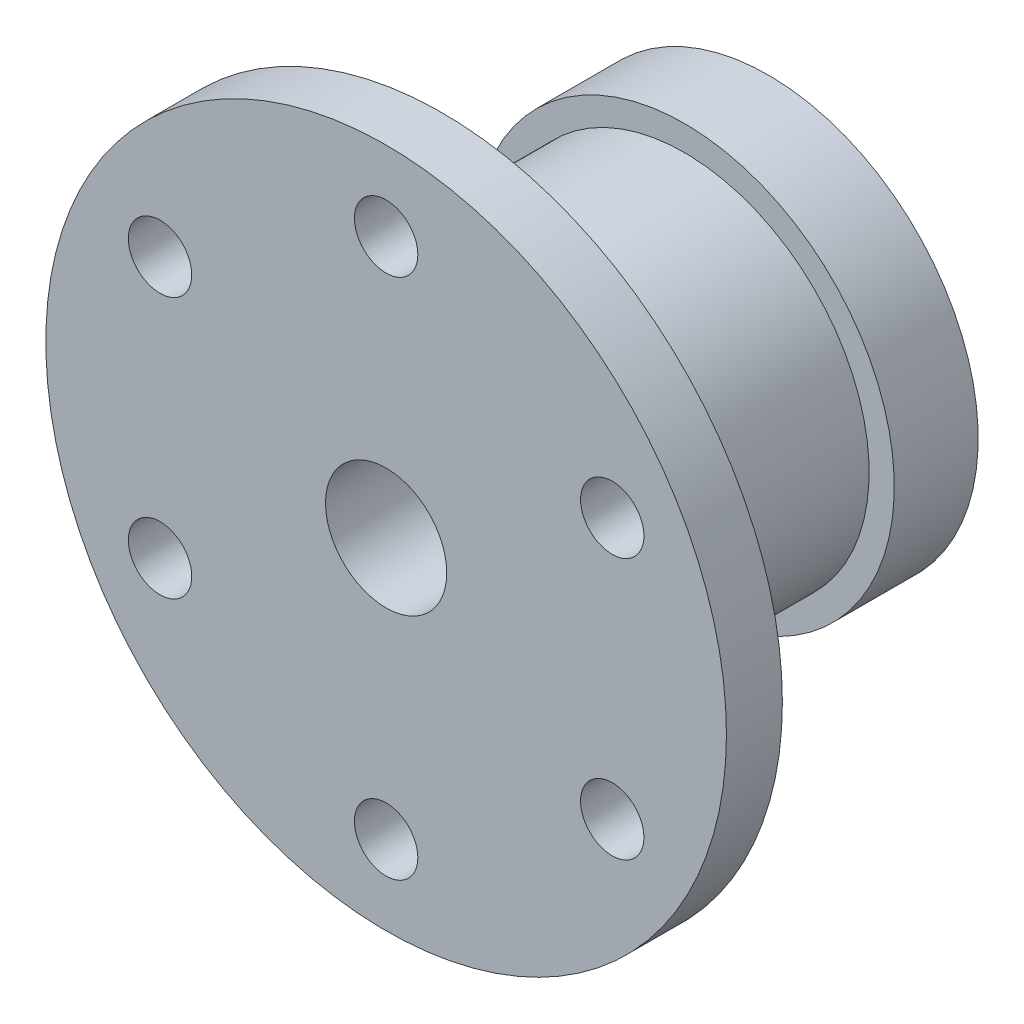
ISO-10303-21;
HEADER;
FILE_DESCRIPTION(('STEP AP214'),'2;1');
FILE_NAME('part.step','',(''),(''),'','','');
FILE_SCHEMA(('AUTOMOTIVE_DESIGN { 1 0 10303 214 1 1 1 1 }'));
ENDSEC;
DATA;
#1=APPLICATION_CONTEXT('core data for automotive mechanical design processes');
#2=APPLICATION_PROTOCOL_DEFINITION('international standard','automotive_design',2000,#1);
#3=PRODUCT_CONTEXT('',#1,'mechanical');
#4=PRODUCT('Part','Part','',(#3));
#5=PRODUCT_RELATED_PRODUCT_CATEGORY('part','',(#4));
#6=PRODUCT_DEFINITION_FORMATION('','',#4);
#7=PRODUCT_DEFINITION_CONTEXT('part definition',#1,'design');
#8=PRODUCT_DEFINITION('design','',#6,#7);
#9=PRODUCT_DEFINITION_SHAPE('','',#8);
#10=(LENGTH_UNIT() NAMED_UNIT(*) SI_UNIT(.MILLI.,.METRE.));
#11=(NAMED_UNIT(*) PLANE_ANGLE_UNIT() SI_UNIT($,.RADIAN.));
#12=(NAMED_UNIT(*) SI_UNIT($,.STERADIAN.) SOLID_ANGLE_UNIT());
#13=UNCERTAINTY_MEASURE_WITH_UNIT(LENGTH_MEASURE(1.E-05),#10,'distance_accuracy_value','');
#14=(GEOMETRIC_REPRESENTATION_CONTEXT(3) GLOBAL_UNCERTAINTY_ASSIGNED_CONTEXT((#13)) GLOBAL_UNIT_ASSIGNED_CONTEXT((#10,
#11,#12)) REPRESENTATION_CONTEXT('',''));
#15=CARTESIAN_POINT('',(0.,0.,0.));
#16=DIRECTION('',(0.,0.,1.));
#17=DIRECTION('',(1.,0.,0.));
#18=AXIS2_PLACEMENT_3D('',#15,#16,#17);
#19=CARTESIAN_POINT('',(0.,0.,3.));
#20=DIRECTION('',(0.,0.,-1.));
#21=DIRECTION('',(-1.,0.,0.));
#22=AXIS2_PLACEMENT_3D('',#19,#20,#21);
#23=CYLINDRICAL_SURFACE('',#22,3.25);
#24=CARTESIAN_POINT('',(0.,0.,3.));
#25=DIRECTION('',(0.,0.,1.));
#26=DIRECTION('',(1.,0.,0.));
#27=AXIS2_PLACEMENT_3D('',#24,#25,#26);
#28=CIRCLE('',#27,3.25);
#29=CARTESIAN_POINT('',(3.25,0.,3.));
#30=VERTEX_POINT('',#29);
#31=EDGE_CURVE('E60',#30,#30,#28,.T.);
#32=ORIENTED_EDGE('',*,*,#31,.T.);
#33=EDGE_LOOP('',(#32));
#34=FACE_BOUND('',#33,.T.);
#35=CARTESIAN_POINT('',(0.,0.,-16.9));
#36=DIRECTION('',(0.,0.,-1.));
#37=DIRECTION('',(-1.,0.,0.));
#38=AXIS2_PLACEMENT_3D('',#35,#36,#37);
#39=CIRCLE('',#38,3.25);
#40=CARTESIAN_POINT('',(-3.25,0.,-16.9));
#41=VERTEX_POINT('',#40);
#42=EDGE_CURVE('E43',#41,#41,#39,.T.);
#43=ORIENTED_EDGE('',*,*,#42,.T.);
#44=EDGE_LOOP('',(#43));
#45=FACE_BOUND('',#44,.T.);
#46=ADVANCED_FACE('F39',(#34,#45),#23,.F.);
#47=CARTESIAN_POINT('',(0.,0.,-17.5));
#48=DIRECTION('',(0.,0.,1.));
#49=DIRECTION('',(1.,0.,0.));
#50=AXIS2_PLACEMENT_3D('',#47,#48,#49);
#51=CYLINDRICAL_SURFACE('',#50,9.9);
#52=CARTESIAN_POINT('',(0.,0.,0.));
#53=DIRECTION('',(0.,0.,-1.));
#54=DIRECTION('',(-1.,0.,0.));
#55=AXIS2_PLACEMENT_3D('',#52,#53,#54);
#56=CIRCLE('',#55,9.9);
#57=CARTESIAN_POINT('',(-9.9,0.,0.));
#58=VERTEX_POINT('',#57);
#59=EDGE_CURVE('E50',#58,#58,#56,.T.);
#60=ORIENTED_EDGE('',*,*,#59,.T.);
#61=EDGE_LOOP('',(#60));
#62=FACE_BOUND('',#61,.T.);
#63=CARTESIAN_POINT('',(0.,0.,-13.));
#64=DIRECTION('',(0.,0.,-1.));
#65=DIRECTION('',(-1.,0.,0.));
#66=AXIS2_PLACEMENT_3D('',#63,#64,#65);
#67=CIRCLE('',#66,9.9);
#68=CARTESIAN_POINT('',(-9.9,0.,-13.));
#69=VERTEX_POINT('',#68);
#70=EDGE_CURVE('E10',#69,#69,#67,.T.);
#71=ORIENTED_EDGE('',*,*,#70,.F.);
#72=EDGE_LOOP('',(#71));
#73=FACE_BOUND('',#72,.T.);
#74=ADVANCED_FACE('F183',(#62,#73),#51,.T.);
#75=CARTESIAN_POINT('',(0.,0.,3.));
#76=DIRECTION('',(0.,0.,1.));
#77=DIRECTION('',(1.,0.,0.));
#78=AXIS2_PLACEMENT_3D('',#75,#76,#77);
#79=PLANE('',#78);
#80=CARTESIAN_POINT('',(12.1243556529821,-7.,3.));
#81=DIRECTION('',(0.,0.,1.));
#82=DIRECTION('',(1.,0.,0.));
#83=AXIS2_PLACEMENT_3D('',#80,#81,#82);
#84=CIRCLE('',#83,1.7);
#85=CARTESIAN_POINT('',(13.8243556529821,-7.,3.));
#86=VERTEX_POINT('',#85);
#87=EDGE_CURVE('E80',#86,#86,#84,.T.);
#88=ORIENTED_EDGE('',*,*,#87,.F.);
#89=EDGE_LOOP('',(#88));
#90=FACE_BOUND('',#89,.T.);
#91=CARTESIAN_POINT('',(0.,-14.,3.));
#92=DIRECTION('',(0.,0.,1.));
#93=DIRECTION('',(1.,0.,0.));
#94=AXIS2_PLACEMENT_3D('',#91,#92,#93);
#95=CIRCLE('',#94,1.7);
#96=CARTESIAN_POINT('',(1.7,-14.,3.));
#97=VERTEX_POINT('',#96);
#98=EDGE_CURVE('E83',#97,#97,#95,.T.);
#99=ORIENTED_EDGE('',*,*,#98,.F.);
#100=EDGE_LOOP('',(#99));
#101=FACE_BOUND('',#100,.T.);
#102=CARTESIAN_POINT('',(-12.1243556529821,-7.,3.));
#103=DIRECTION('',(0.,0.,1.));
#104=DIRECTION('',(1.,0.,0.));
#105=AXIS2_PLACEMENT_3D('',#102,#103,#104);
#106=CIRCLE('',#105,1.7);
#107=CARTESIAN_POINT('',(-10.4243556529821,-7.,3.));
#108=VERTEX_POINT('',#107);
#109=EDGE_CURVE('E89',#108,#108,#106,.T.);
#110=ORIENTED_EDGE('',*,*,#109,.F.);
#111=EDGE_LOOP('',(#110));
#112=FACE_BOUND('',#111,.T.);
#113=CARTESIAN_POINT('',(-12.1243556529821,7.,3.));
#114=DIRECTION('',(0.,0.,1.));
#115=DIRECTION('',(1.,0.,0.));
#116=AXIS2_PLACEMENT_3D('',#113,#114,#115);
#117=CIRCLE('',#116,1.7);
#118=CARTESIAN_POINT('',(-10.4243556529821,7.,3.));
#119=VERTEX_POINT('',#118);
#120=EDGE_CURVE('E96',#119,#119,#117,.T.);
#121=ORIENTED_EDGE('',*,*,#120,.F.);
#122=EDGE_LOOP('',(#121));
#123=FACE_BOUND('',#122,.T.);
#124=CARTESIAN_POINT('',(0.,14.,3.));
#125=DIRECTION('',(0.,0.,1.));
#126=DIRECTION('',(1.,0.,0.));
#127=AXIS2_PLACEMENT_3D('',#124,#125,#126);
#128=CIRCLE('',#127,1.7);
#129=CARTESIAN_POINT('',(1.7,14.,3.));
#130=VERTEX_POINT('',#129);
#131=EDGE_CURVE('E75',#130,#130,#128,.T.);
#132=ORIENTED_EDGE('',*,*,#131,.F.);
#133=EDGE_LOOP('',(#132));
#134=FACE_BOUND('',#133,.T.);
#135=CARTESIAN_POINT('',(12.1243556529821,7.,3.));
#136=DIRECTION('',(0.,0.,1.));
#137=DIRECTION('',(1.,0.,0.));
#138=AXIS2_PLACEMENT_3D('',#135,#136,#137);
#139=CIRCLE('',#138,1.7);
#140=CARTESIAN_POINT('',(13.8243556529821,7.,3.));
#141=VERTEX_POINT('',#140);
#142=EDGE_CURVE('E68',#141,#141,#139,.T.);
#143=ORIENTED_EDGE('',*,*,#142,.F.);
#144=EDGE_LOOP('',(#143));
#145=FACE_BOUND('',#144,.T.);
#146=CARTESIAN_POINT('',(0.,0.,3.));
#147=DIRECTION('',(0.,0.,1.));
#148=DIRECTION('',(1.,0.,0.));
#149=AXIS2_PLACEMENT_3D('',#146,#147,#148);
#150=CIRCLE('',#149,18.25);
#151=CARTESIAN_POINT('',(18.25,0.,3.));
#152=VERTEX_POINT('',#151);
#153=EDGE_CURVE('E51',#152,#152,#150,.T.);
#154=ORIENTED_EDGE('',*,*,#153,.T.);
#155=EDGE_LOOP('',(#154));
#156=FACE_BOUND('',#155,.T.);
#157=ORIENTED_EDGE('',*,*,#31,.F.);
#158=EDGE_LOOP('',(#157));
#159=FACE_BOUND('',#158,.T.);
#160=ADVANCED_FACE('F191',(#90,#101,#112,#123,#134,#145,#156,#159),#79,.T.);
#161=CARTESIAN_POINT('',(0.,0.,0.));
#162=DIRECTION('',(0.,0.,1.));
#163=DIRECTION('',(1.,0.,0.));
#164=AXIS2_PLACEMENT_3D('',#161,#162,#163);
#165=PLANE('',#164);
#166=CARTESIAN_POINT('',(12.1243556529821,-7.,0.));
#167=DIRECTION('',(0.,0.,1.));
#168=DIRECTION('',(1.,0.,0.));
#169=AXIS2_PLACEMENT_3D('',#166,#167,#168);
#170=CIRCLE('',#169,1.7);
#171=CARTESIAN_POINT('',(13.8243556529821,-7.,0.));
#172=VERTEX_POINT('',#171);
#173=EDGE_CURVE('E73',#172,#172,#170,.T.);
#174=ORIENTED_EDGE('',*,*,#173,.T.);
#175=EDGE_LOOP('',(#174));
#176=FACE_BOUND('',#175,.T.);
#177=CARTESIAN_POINT('',(0.,-14.,0.));
#178=DIRECTION('',(0.,0.,1.));
#179=DIRECTION('',(1.,0.,0.));
#180=AXIS2_PLACEMENT_3D('',#177,#178,#179);
#181=CIRCLE('',#180,1.7);
#182=CARTESIAN_POINT('',(1.7,-14.,0.));
#183=VERTEX_POINT('',#182);
#184=EDGE_CURVE('E81',#183,#183,#181,.T.);
#185=ORIENTED_EDGE('',*,*,#184,.T.);
#186=EDGE_LOOP('',(#185));
#187=FACE_BOUND('',#186,.T.);
#188=CARTESIAN_POINT('',(-12.1243556529821,-7.,0.));
#189=DIRECTION('',(0.,0.,1.));
#190=DIRECTION('',(1.,0.,0.));
#191=AXIS2_PLACEMENT_3D('',#188,#189,#190);
#192=CIRCLE('',#191,1.7);
#193=CARTESIAN_POINT('',(-10.4243556529821,-7.,0.));
#194=VERTEX_POINT('',#193);
#195=EDGE_CURVE('E87',#194,#194,#192,.T.);
#196=ORIENTED_EDGE('',*,*,#195,.T.);
#197=EDGE_LOOP('',(#196));
#198=FACE_BOUND('',#197,.T.);
#199=CARTESIAN_POINT('',(-12.1243556529821,7.,0.));
#200=DIRECTION('',(0.,0.,1.));
#201=DIRECTION('',(1.,0.,0.));
#202=AXIS2_PLACEMENT_3D('',#199,#200,#201);
#203=CIRCLE('',#202,1.7);
#204=CARTESIAN_POINT('',(-10.4243556529821,7.,0.));
#205=VERTEX_POINT('',#204);
#206=EDGE_CURVE('E91',#205,#205,#203,.T.);
#207=ORIENTED_EDGE('',*,*,#206,.T.);
#208=EDGE_LOOP('',(#207));
#209=FACE_BOUND('',#208,.T.);
#210=CARTESIAN_POINT('',(0.,14.,0.));
#211=DIRECTION('',(0.,0.,1.));
#212=DIRECTION('',(1.,0.,0.));
#213=AXIS2_PLACEMENT_3D('',#210,#211,#212);
#214=CIRCLE('',#213,1.7);
#215=CARTESIAN_POINT('',(1.7,14.,0.));
#216=VERTEX_POINT('',#215);
#217=EDGE_CURVE('E97',#216,#216,#214,.T.);
#218=ORIENTED_EDGE('',*,*,#217,.T.);
#219=EDGE_LOOP('',(#218));
#220=FACE_BOUND('',#219,.T.);
#221=CARTESIAN_POINT('',(12.1243556529821,7.,0.));
#222=DIRECTION('',(0.,0.,1.));
#223=DIRECTION('',(1.,0.,0.));
#224=AXIS2_PLACEMENT_3D('',#221,#222,#223);
#225=CIRCLE('',#224,1.7);
#226=CARTESIAN_POINT('',(13.8243556529821,7.,0.));
#227=VERTEX_POINT('',#226);
#228=EDGE_CURVE('E66',#227,#227,#225,.T.);
#229=ORIENTED_EDGE('',*,*,#228,.T.);
#230=EDGE_LOOP('',(#229));
#231=FACE_BOUND('',#230,.T.);
#232=ORIENTED_EDGE('',*,*,#59,.F.);
#233=EDGE_LOOP('',(#232));
#234=FACE_BOUND('',#233,.T.);
#235=CARTESIAN_POINT('',(0.,0.,0.));
#236=DIRECTION('',(0.,0.,1.));
#237=DIRECTION('',(1.,0.,0.));
#238=AXIS2_PLACEMENT_3D('',#235,#236,#237);
#239=CIRCLE('',#238,18.25);
#240=CARTESIAN_POINT('',(18.25,0.,0.));
#241=VERTEX_POINT('',#240);
#242=EDGE_CURVE('E53',#241,#241,#239,.T.);
#243=ORIENTED_EDGE('',*,*,#242,.F.);
#244=EDGE_LOOP('',(#243));
#245=FACE_BOUND('',#244,.T.);
#246=ADVANCED_FACE('F197',(#176,#187,#198,#209,#220,#231,#234,#245),#165,.F.);
#247=CARTESIAN_POINT('',(0.,0.,3.));
#248=DIRECTION('',(0.,0.,-1.));
#249=DIRECTION('',(-1.,0.,0.));
#250=AXIS2_PLACEMENT_3D('',#247,#248,#249);
#251=CYLINDRICAL_SURFACE('',#250,18.25);
#252=ORIENTED_EDGE('',*,*,#153,.F.);
#253=EDGE_LOOP('',(#252));
#254=FACE_BOUND('',#253,.T.);
#255=ORIENTED_EDGE('',*,*,#242,.T.);
#256=EDGE_LOOP('',(#255));
#257=FACE_BOUND('',#256,.T.);
#258=ADVANCED_FACE('F41',(#254,#257),#251,.T.);
#259=CARTESIAN_POINT('',(0.,0.,-17.5));
#260=DIRECTION('',(0.,0.,-1.));
#261=DIRECTION('',(-1.,0.,0.));
#262=AXIS2_PLACEMENT_3D('',#259,#260,#261);
#263=PLANE('',#262);
#264=CARTESIAN_POINT('',(0.,0.,-17.5));
#265=DIRECTION('',(0.,0.,-1.));
#266=DIRECTION('',(-1.,0.,0.));
#267=AXIS2_PLACEMENT_3D('',#264,#265,#266);
#268=CIRCLE('',#267,10.175);
#269=CARTESIAN_POINT('',(-10.175,0.,-17.5));
#270=VERTEX_POINT('',#269);
#271=EDGE_CURVE('E102',#270,#270,#268,.T.);
#272=ORIENTED_EDGE('',*,*,#271,.F.);
#273=EDGE_LOOP('',(#272));
#274=FACE_BOUND('',#273,.T.);
#275=CARTESIAN_POINT('',(0.,0.,-17.5));
#276=DIRECTION('',(0.,0.,-1.));
#277=DIRECTION('',(-1.,0.,0.));
#278=AXIS2_PLACEMENT_3D('',#275,#276,#277);
#279=CIRCLE('',#278,11.25);
#280=CARTESIAN_POINT('',(-11.25,0.,-17.5));
#281=VERTEX_POINT('',#280);
#282=EDGE_CURVE('E65',#281,#281,#279,.T.);
#283=ORIENTED_EDGE('',*,*,#282,.T.);
#284=EDGE_LOOP('',(#283));
#285=FACE_BOUND('',#284,.T.);
#286=ADVANCED_FACE('F170',(#274,#285),#263,.T.);
#287=CARTESIAN_POINT('',(0.,0.,-13.));
#288=DIRECTION('',(0.,0.,-1.));
#289=DIRECTION('',(-1.,0.,0.));
#290=AXIS2_PLACEMENT_3D('',#287,#288,#289);
#291=CYLINDRICAL_SURFACE('',#290,11.25);
#292=CARTESIAN_POINT('',(0.,0.,-13.));
#293=DIRECTION('',(0.,0.,-1.));
#294=DIRECTION('',(-1.,0.,0.));
#295=AXIS2_PLACEMENT_3D('',#292,#293,#294);
#296=CIRCLE('',#295,11.25);
#297=CARTESIAN_POINT('',(-11.25,0.,-13.));
#298=VERTEX_POINT('',#297);
#299=EDGE_CURVE('E62',#298,#298,#296,.T.);
#300=ORIENTED_EDGE('',*,*,#299,.T.);
#301=EDGE_LOOP('',(#300));
#302=FACE_BOUND('',#301,.T.);
#303=ORIENTED_EDGE('',*,*,#282,.F.);
#304=EDGE_LOOP('',(#303));
#305=FACE_BOUND('',#304,.T.);
#306=ADVANCED_FACE('F168',(#302,#305),#291,.T.);
#307=CARTESIAN_POINT('',(0.,0.,-13.));
#308=DIRECTION('',(0.,0.,-1.));
#309=DIRECTION('',(-1.,0.,0.));
#310=AXIS2_PLACEMENT_3D('',#307,#308,#309);
#311=PLANE('',#310);
#312=ORIENTED_EDGE('',*,*,#70,.T.);
#313=EDGE_LOOP('',(#312));
#314=FACE_BOUND('',#313,.T.);
#315=ORIENTED_EDGE('',*,*,#299,.F.);
#316=EDGE_LOOP('',(#315));
#317=FACE_BOUND('',#316,.T.);
#318=ADVANCED_FACE('F173',(#314,#317),#311,.F.);
#319=CARTESIAN_POINT('',(12.1243556529821,7.,0.));
#320=DIRECTION('',(0.,0.,1.));
#321=DIRECTION('',(1.,0.,0.));
#322=AXIS2_PLACEMENT_3D('',#319,#320,#321);
#323=CYLINDRICAL_SURFACE('',#322,1.7);
#324=ORIENTED_EDGE('',*,*,#228,.F.);
#325=EDGE_LOOP('',(#324));
#326=FACE_BOUND('',#325,.T.);
#327=ORIENTED_EDGE('',*,*,#142,.T.);
#328=EDGE_LOOP('',(#327));
#329=FACE_BOUND('',#328,.T.);
#330=ADVANCED_FACE('F185',(#326,#329),#323,.F.);
#331=CARTESIAN_POINT('',(0.,14.,0.));
#332=DIRECTION('',(0.,0.,1.));
#333=DIRECTION('',(1.,0.,0.));
#334=AXIS2_PLACEMENT_3D('',#331,#332,#333);
#335=CYLINDRICAL_SURFACE('',#334,1.7);
#336=ORIENTED_EDGE('',*,*,#217,.F.);
#337=EDGE_LOOP('',(#336));
#338=FACE_BOUND('',#337,.T.);
#339=ORIENTED_EDGE('',*,*,#131,.T.);
#340=EDGE_LOOP('',(#339));
#341=FACE_BOUND('',#340,.T.);
#342=ADVANCED_FACE('F223',(#338,#341),#335,.F.);
#343=CARTESIAN_POINT('',(-12.1243556529821,7.,0.));
#344=DIRECTION('',(0.,0.,1.));
#345=DIRECTION('',(1.,0.,0.));
#346=AXIS2_PLACEMENT_3D('',#343,#344,#345);
#347=CYLINDRICAL_SURFACE('',#346,1.7);
#348=ORIENTED_EDGE('',*,*,#206,.F.);
#349=EDGE_LOOP('',(#348));
#350=FACE_BOUND('',#349,.T.);
#351=ORIENTED_EDGE('',*,*,#120,.T.);
#352=EDGE_LOOP('',(#351));
#353=FACE_BOUND('',#352,.T.);
#354=ADVANCED_FACE('F237',(#350,#353),#347,.F.);
#355=CARTESIAN_POINT('',(-12.1243556529821,-7.,0.));
#356=DIRECTION('',(0.,0.,1.));
#357=DIRECTION('',(1.,0.,0.));
#358=AXIS2_PLACEMENT_3D('',#355,#356,#357);
#359=CYLINDRICAL_SURFACE('',#358,1.7);
#360=ORIENTED_EDGE('',*,*,#195,.F.);
#361=EDGE_LOOP('',(#360));
#362=FACE_BOUND('',#361,.T.);
#363=ORIENTED_EDGE('',*,*,#109,.T.);
#364=EDGE_LOOP('',(#363));
#365=FACE_BOUND('',#364,.T.);
#366=ADVANCED_FACE('F243',(#362,#365),#359,.F.);
#367=CARTESIAN_POINT('',(0.,-14.,0.));
#368=DIRECTION('',(0.,0.,1.));
#369=DIRECTION('',(1.,0.,0.));
#370=AXIS2_PLACEMENT_3D('',#367,#368,#369);
#371=CYLINDRICAL_SURFACE('',#370,1.7);
#372=ORIENTED_EDGE('',*,*,#184,.F.);
#373=EDGE_LOOP('',(#372));
#374=FACE_BOUND('',#373,.T.);
#375=ORIENTED_EDGE('',*,*,#98,.T.);
#376=EDGE_LOOP('',(#375));
#377=FACE_BOUND('',#376,.T.);
#378=ADVANCED_FACE('F242',(#374,#377),#371,.F.);
#379=CARTESIAN_POINT('',(12.1243556529821,-7.,0.));
#380=DIRECTION('',(0.,0.,1.));
#381=DIRECTION('',(1.,0.,0.));
#382=AXIS2_PLACEMENT_3D('',#379,#380,#381);
#383=CYLINDRICAL_SURFACE('',#382,1.7);
#384=ORIENTED_EDGE('',*,*,#173,.F.);
#385=EDGE_LOOP('',(#384));
#386=FACE_BOUND('',#385,.T.);
#387=ORIENTED_EDGE('',*,*,#87,.T.);
#388=EDGE_LOOP('',(#387));
#389=FACE_BOUND('',#388,.T.);
#390=ADVANCED_FACE('F162',(#386,#389),#383,.F.);
#391=CARTESIAN_POINT('',(0.,0.,-16.9));
#392=DIRECTION('',(0.,0.,-1.));
#393=DIRECTION('',(-1.,0.,0.));
#394=AXIS2_PLACEMENT_3D('',#391,#392,#393);
#395=CYLINDRICAL_SURFACE('',#394,10.175);
#396=CARTESIAN_POINT('',(0.,0.,-16.9));
#397=DIRECTION('',(0.,0.,-1.));
#398=DIRECTION('',(-1.,0.,0.));
#399=AXIS2_PLACEMENT_3D('',#396,#397,#398);
#400=CIRCLE('',#399,10.175);
#401=CARTESIAN_POINT('',(-10.175,0.,-16.9));
#402=VERTEX_POINT('',#401);
#403=EDGE_CURVE('E110',#402,#402,#400,.T.);
#404=ORIENTED_EDGE('',*,*,#403,.F.);
#405=EDGE_LOOP('',(#404));
#406=FACE_BOUND('',#405,.T.);
#407=ORIENTED_EDGE('',*,*,#271,.T.);
#408=EDGE_LOOP('',(#407));
#409=FACE_BOUND('',#408,.T.);
#410=ADVANCED_FACE('F146',(#406,#409),#395,.F.);
#411=CARTESIAN_POINT('',(0.,0.,-16.9));
#412=DIRECTION('',(0.,0.,-1.));
#413=DIRECTION('',(-1.,0.,0.));
#414=AXIS2_PLACEMENT_3D('',#411,#412,#413);
#415=PLANE('',#414);
#416=CARTESIAN_POINT('',(7.071067811865,0.,-16.9));
#417=DIRECTION('',(0.,0.,-1.));
#418=DIRECTION('',(-1.,0.,0.));
#419=AXIS2_PLACEMENT_3D('',#416,#417,#418);
#420=CIRCLE('',#419,0.8);
#421=CARTESIAN_POINT('',(6.271067811865,0.,-16.9));
#422=VERTEX_POINT('',#421);
#423=EDGE_CURVE('E129',#422,#422,#420,.T.);
#424=ORIENTED_EDGE('',*,*,#423,.F.);
#425=EDGE_LOOP('',(#424));
#426=FACE_BOUND('',#425,.T.);
#427=CARTESIAN_POINT('',(0.,7.071067811865,-16.9));
#428=DIRECTION('',(0.,0.,-1.));
#429=DIRECTION('',(-1.,0.,0.));
#430=AXIS2_PLACEMENT_3D('',#427,#428,#429);
#431=CIRCLE('',#430,0.8);
#432=CARTESIAN_POINT('',(-0.8,7.071067811865,-16.9));
#433=VERTEX_POINT('',#432);
#434=EDGE_CURVE('E127',#433,#433,#431,.T.);
#435=ORIENTED_EDGE('',*,*,#434,.F.);
#436=EDGE_LOOP('',(#435));
#437=FACE_BOUND('',#436,.T.);
#438=CARTESIAN_POINT('',(-7.071067811865,0.,-16.9));
#439=DIRECTION('',(0.,0.,-1.));
#440=DIRECTION('',(-1.,0.,0.));
#441=AXIS2_PLACEMENT_3D('',#438,#439,#440);
#442=CIRCLE('',#441,0.799999999999999);
#443=CARTESIAN_POINT('',(-7.871067811865,0.,-16.9));
#444=VERTEX_POINT('',#443);
#445=EDGE_CURVE('E118',#444,#444,#442,.T.);
#446=ORIENTED_EDGE('',*,*,#445,.F.);
#447=EDGE_LOOP('',(#446));
#448=FACE_BOUND('',#447,.T.);
#449=CARTESIAN_POINT('',(0.,-7.071067811865,-16.9));
#450=DIRECTION('',(0.,0.,-1.));
#451=DIRECTION('',(-1.,0.,0.));
#452=AXIS2_PLACEMENT_3D('',#449,#450,#451);
#453=CIRCLE('',#452,0.8);
#454=CARTESIAN_POINT('',(-0.800000000000001,-7.071067811865,-16.9));
#455=VERTEX_POINT('',#454);
#456=EDGE_CURVE('E111',#455,#455,#453,.T.);
#457=ORIENTED_EDGE('',*,*,#456,.F.);
#458=EDGE_LOOP('',(#457));
#459=FACE_BOUND('',#458,.T.);
#460=ORIENTED_EDGE('',*,*,#42,.F.);
#461=EDGE_LOOP('',(#460));
#462=FACE_BOUND('',#461,.T.);
#463=ORIENTED_EDGE('',*,*,#403,.T.);
#464=EDGE_LOOP('',(#463));
#465=FACE_BOUND('',#464,.T.);
#466=ADVANCED_FACE('F145',(#426,#437,#448,#459,#462,#465),#415,.T.);
#467=CARTESIAN_POINT('',(0.,-7.071067811865,-11.9));
#468=DIRECTION('',(0.,0.,-1.));
#469=DIRECTION('',(-1.,0.,0.));
#470=AXIS2_PLACEMENT_3D('',#467,#468,#469);
#471=CYLINDRICAL_SURFACE('',#470,0.8);
#472=CARTESIAN_POINT('',(0.,-7.071067811865,-11.9));
#473=DIRECTION('',(0.,0.,-1.));
#474=DIRECTION('',(-1.,0.,0.));
#475=AXIS2_PLACEMENT_3D('',#472,#473,#474);
#476=CIRCLE('',#475,0.8);
#477=CARTESIAN_POINT('',(-0.800000000000001,-7.071067811865,-11.9));
#478=VERTEX_POINT('',#477);
#479=EDGE_CURVE('E112',#478,#478,#476,.T.);
#480=ORIENTED_EDGE('',*,*,#479,.F.);
#481=EDGE_LOOP('',(#480));
#482=FACE_BOUND('',#481,.T.);
#483=ORIENTED_EDGE('',*,*,#456,.T.);
#484=EDGE_LOOP('',(#483));
#485=FACE_BOUND('',#484,.T.);
#486=ADVANCED_FACE('F150',(#482,#485),#471,.F.);
#487=CARTESIAN_POINT('',(0.,-7.071067811865,-11.9));
#488=DIRECTION('',(0.,0.,-1.));
#489=DIRECTION('',(-1.,0.,0.));
#490=AXIS2_PLACEMENT_3D('',#487,#488,#489);
#491=PLANE('',#490);
#492=ORIENTED_EDGE('',*,*,#479,.T.);
#493=EDGE_LOOP('',(#492));
#494=FACE_BOUND('',#493,.T.);
#495=ADVANCED_FACE('F251',(#494),#491,.T.);
#496=CARTESIAN_POINT('',(-7.071067811865,0.,-11.9));
#497=DIRECTION('',(0.,0.,-1.));
#498=DIRECTION('',(-1.,0.,0.));
#499=AXIS2_PLACEMENT_3D('',#496,#497,#498);
#500=CYLINDRICAL_SURFACE('',#499,0.799999999999999);
#501=CARTESIAN_POINT('',(-7.071067811865,0.,-11.9));
#502=DIRECTION('',(0.,0.,-1.));
#503=DIRECTION('',(-1.,0.,0.));
#504=AXIS2_PLACEMENT_3D('',#501,#502,#503);
#505=CIRCLE('',#504,0.799999999999999);
#506=CARTESIAN_POINT('',(-7.871067811865,0.,-11.9));
#507=VERTEX_POINT('',#506);
#508=EDGE_CURVE('E119',#507,#507,#505,.T.);
#509=ORIENTED_EDGE('',*,*,#508,.F.);
#510=EDGE_LOOP('',(#509));
#511=FACE_BOUND('',#510,.T.);
#512=ORIENTED_EDGE('',*,*,#445,.T.);
#513=EDGE_LOOP('',(#512));
#514=FACE_BOUND('',#513,.T.);
#515=ADVANCED_FACE('F258',(#511,#514),#500,.F.);
#516=CARTESIAN_POINT('',(-7.071067811865,0.,-11.9));
#517=DIRECTION('',(0.,0.,-1.));
#518=DIRECTION('',(-1.,0.,0.));
#519=AXIS2_PLACEMENT_3D('',#516,#517,#518);
#520=PLANE('',#519);
#521=ORIENTED_EDGE('',*,*,#508,.T.);
#522=EDGE_LOOP('',(#521));
#523=FACE_BOUND('',#522,.T.);
#524=ADVANCED_FACE('F261',(#523),#520,.T.);
#525=CARTESIAN_POINT('',(0.,7.071067811865,-11.9));
#526=DIRECTION('',(0.,0.,-1.));
#527=DIRECTION('',(-1.,0.,0.));
#528=AXIS2_PLACEMENT_3D('',#525,#526,#527);
#529=CYLINDRICAL_SURFACE('',#528,0.8);
#530=CARTESIAN_POINT('',(0.,7.071067811865,-11.9));
#531=DIRECTION('',(0.,0.,-1.));
#532=DIRECTION('',(-1.,0.,0.));
#533=AXIS2_PLACEMENT_3D('',#530,#531,#532);
#534=CIRCLE('',#533,0.8);
#535=CARTESIAN_POINT('',(-0.8,7.071067811865,-11.9));
#536=VERTEX_POINT('',#535);
#537=EDGE_CURVE('E122',#536,#536,#534,.T.);
#538=ORIENTED_EDGE('',*,*,#537,.F.);
#539=EDGE_LOOP('',(#538));
#540=FACE_BOUND('',#539,.T.);
#541=ORIENTED_EDGE('',*,*,#434,.T.);
#542=EDGE_LOOP('',(#541));
#543=FACE_BOUND('',#542,.T.);
#544=ADVANCED_FACE('F262',(#540,#543),#529,.F.);
#545=CARTESIAN_POINT('',(0.,7.071067811865,-11.9));
#546=DIRECTION('',(0.,0.,-1.));
#547=DIRECTION('',(-1.,0.,0.));
#548=AXIS2_PLACEMENT_3D('',#545,#546,#547);
#549=PLANE('',#548);
#550=ORIENTED_EDGE('',*,*,#537,.T.);
#551=EDGE_LOOP('',(#550));
#552=FACE_BOUND('',#551,.T.);
#553=ADVANCED_FACE('F139',(#552),#549,.T.);
#554=CARTESIAN_POINT('',(7.071067811865,0.,-11.9));
#555=DIRECTION('',(0.,0.,-1.));
#556=DIRECTION('',(-1.,0.,0.));
#557=AXIS2_PLACEMENT_3D('',#554,#555,#556);
#558=CYLINDRICAL_SURFACE('',#557,0.8);
#559=CARTESIAN_POINT('',(7.071067811865,0.,-11.9));
#560=DIRECTION('',(0.,0.,-1.));
#561=DIRECTION('',(-1.,0.,0.));
#562=AXIS2_PLACEMENT_3D('',#559,#560,#561);
#563=CIRCLE('',#562,0.8);
#564=CARTESIAN_POINT('',(6.271067811865,0.,-11.9));
#565=VERTEX_POINT('',#564);
#566=EDGE_CURVE('E107',#565,#565,#563,.T.);
#567=ORIENTED_EDGE('',*,*,#566,.F.);
#568=EDGE_LOOP('',(#567));
#569=FACE_BOUND('',#568,.T.);
#570=ORIENTED_EDGE('',*,*,#423,.T.);
#571=EDGE_LOOP('',(#570));
#572=FACE_BOUND('',#571,.T.);
#573=ADVANCED_FACE('F140',(#569,#572),#558,.F.);
#574=CARTESIAN_POINT('',(7.071067811865,0.,-11.9));
#575=DIRECTION('',(0.,0.,-1.));
#576=DIRECTION('',(-1.,0.,0.));
#577=AXIS2_PLACEMENT_3D('',#574,#575,#576);
#578=PLANE('',#577);
#579=ORIENTED_EDGE('',*,*,#566,.T.);
#580=EDGE_LOOP('',(#579));
#581=FACE_BOUND('',#580,.T.);
#582=ADVANCED_FACE('F133',(#581),#578,.T.);
#583=CLOSED_SHELL('',(#46,#74,#160,#246,#258,#286,#306,#318,#330,#342,#354,#366,#378,#390,#410,
#466,#486,#495,#515,#524,#544,#553,#573,#582));
#584=MANIFOLD_SOLID_BREP('B2',#583);
#585=ADVANCED_BREP_SHAPE_REPRESENTATION('',(#18,#584),#14);
#586=SHAPE_DEFINITION_REPRESENTATION(#9,#585);
ENDSEC;
END-ISO-10303-21;
